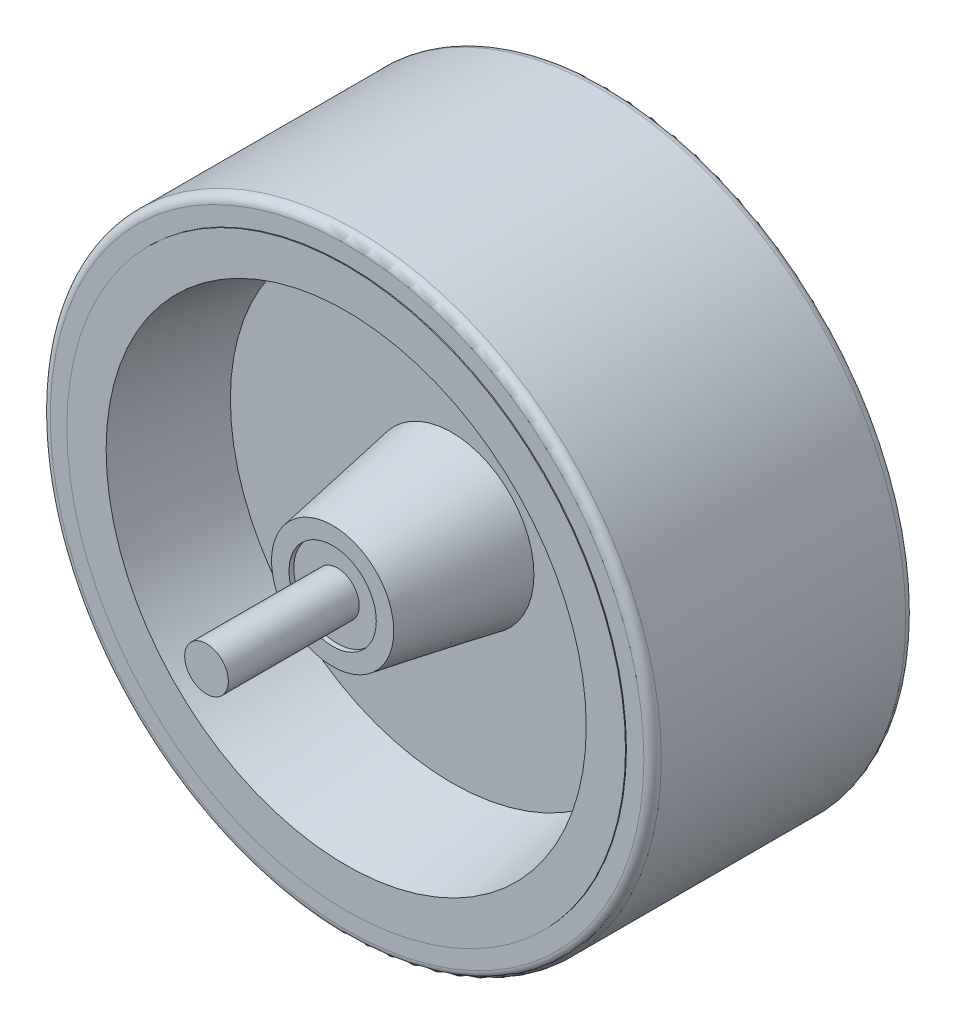
ISO-10303-21;
HEADER;
FILE_DESCRIPTION(('STEP AP214'),'2;1');
FILE_NAME('part.step','',(''),(''),'','','');
FILE_SCHEMA(('AUTOMOTIVE_DESIGN { 1 0 10303 214 1 1 1 1 }'));
ENDSEC;
DATA;
#1=APPLICATION_CONTEXT('core data for automotive mechanical design processes');
#2=APPLICATION_PROTOCOL_DEFINITION('international standard','automotive_design',2000,#1);
#3=PRODUCT_CONTEXT('',#1,'mechanical');
#4=PRODUCT('Part','Part','',(#3));
#5=PRODUCT_RELATED_PRODUCT_CATEGORY('part','',(#4));
#6=PRODUCT_DEFINITION_FORMATION('','',#4);
#7=PRODUCT_DEFINITION_CONTEXT('part definition',#1,'design');
#8=PRODUCT_DEFINITION('design','',#6,#7);
#9=PRODUCT_DEFINITION_SHAPE('','',#8);
#10=(LENGTH_UNIT() NAMED_UNIT(*) SI_UNIT(.MILLI.,.METRE.));
#11=(NAMED_UNIT(*) PLANE_ANGLE_UNIT() SI_UNIT($,.RADIAN.));
#12=(NAMED_UNIT(*) SI_UNIT($,.STERADIAN.) SOLID_ANGLE_UNIT());
#13=UNCERTAINTY_MEASURE_WITH_UNIT(LENGTH_MEASURE(1.E-05),#10,'distance_accuracy_value','');
#14=(GEOMETRIC_REPRESENTATION_CONTEXT(3) GLOBAL_UNCERTAINTY_ASSIGNED_CONTEXT((#13)) GLOBAL_UNIT_ASSIGNED_CONTEXT((#10,
#11,#12)) REPRESENTATION_CONTEXT('',''));
#15=CARTESIAN_POINT('',(0.,0.,0.));
#16=DIRECTION('',(0.,0.,1.));
#17=DIRECTION('',(1.,0.,0.));
#18=AXIS2_PLACEMENT_3D('',#15,#16,#17);
#19=CARTESIAN_POINT('',(0.,0.,-40.894));
#20=DIRECTION('',(0.,0.,1.));
#21=DIRECTION('',(1.,0.,0.));
#22=AXIS2_PLACEMENT_3D('',#19,#20,#21);
#23=PLANE('',#22);
#24=CARTESIAN_POINT('',(0.,0.,-40.894));
#25=DIRECTION('',(0.,0.,1.));
#26=DIRECTION('',(1.,0.,0.));
#27=AXIS2_PLACEMENT_3D('',#24,#25,#26);
#28=CIRCLE('',#27,6.35);
#29=CARTESIAN_POINT('',(6.35,0.,-40.894));
#30=VERTEX_POINT('',#29);
#31=EDGE_CURVE('E11',#30,#30,#28,.F.);
#32=ORIENTED_EDGE('',*,*,#31,.F.);
#33=EDGE_LOOP('',(#32));
#34=FACE_BOUND('',#33,.T.);
#35=CARTESIAN_POINT('',(0.,0.,-40.894));
#36=DIRECTION('',(0.,0.,1.));
#37=DIRECTION('',(1.,0.,0.));
#38=AXIS2_PLACEMENT_3D('',#35,#36,#37);
#39=CIRCLE('',#38,12.7);
#40=CARTESIAN_POINT('',(12.7,0.,-40.894));
#41=VERTEX_POINT('',#40);
#42=EDGE_CURVE('E96',#41,#41,#39,.T.);
#43=ORIENTED_EDGE('',*,*,#42,.F.);
#44=EDGE_LOOP('',(#43));
#45=FACE_BOUND('',#44,.T.);
#46=ADVANCED_FACE('F44',(#34,#45),#23,.F.);
#47=CARTESIAN_POINT('',(0.,0.,40.894));
#48=DIRECTION('',(0.,0.,-1.));
#49=DIRECTION('',(-1.,0.,0.));
#50=AXIS2_PLACEMENT_3D('',#47,#48,#49);
#51=PLANE('',#50);
#52=CARTESIAN_POINT('',(0.,0.,40.894));
#53=DIRECTION('',(0.,0.,-1.));
#54=DIRECTION('',(-1.,0.,0.));
#55=AXIS2_PLACEMENT_3D('',#52,#53,#54);
#56=CIRCLE('',#55,6.35);
#57=CARTESIAN_POINT('',(-6.35,0.,40.894));
#58=VERTEX_POINT('',#57);
#59=EDGE_CURVE('E50',#58,#58,#56,.F.);
#60=ORIENTED_EDGE('',*,*,#59,.F.);
#61=EDGE_LOOP('',(#60));
#62=FACE_BOUND('',#61,.T.);
#63=CARTESIAN_POINT('',(0.,0.,40.894));
#64=DIRECTION('',(0.,0.,1.));
#65=DIRECTION('',(1.,0.,0.));
#66=AXIS2_PLACEMENT_3D('',#63,#64,#65);
#67=CIRCLE('',#66,12.7);
#68=CARTESIAN_POINT('',(12.7,0.,40.894));
#69=VERTEX_POINT('',#68);
#70=EDGE_CURVE('E54',#69,#69,#67,.T.);
#71=ORIENTED_EDGE('',*,*,#70,.T.);
#72=EDGE_LOOP('',(#71));
#73=FACE_BOUND('',#72,.T.);
#74=ADVANCED_FACE('F121',(#62,#73),#51,.F.);
#75=CARTESIAN_POINT('',(0.,0.,0.));
#76=DIRECTION('',(0.,0.,1.));
#77=DIRECTION('',(1.,0.,0.));
#78=AXIS2_PLACEMENT_3D('',#75,#76,#77);
#79=CYLINDRICAL_SURFACE('',#78,12.7);
#80=ORIENTED_EDGE('',*,*,#70,.F.);
#81=EDGE_LOOP('',(#80));
#82=FACE_BOUND('',#81,.T.);
#83=CARTESIAN_POINT('',(0.,0.,42.291));
#84=DIRECTION('',(0.,0.,1.));
#85=DIRECTION('',(1.,0.,0.));
#86=AXIS2_PLACEMENT_3D('',#83,#84,#85);
#87=CIRCLE('',#86,12.7);
#88=CARTESIAN_POINT('',(12.7,0.,42.291));
#89=VERTEX_POINT('',#88);
#90=EDGE_CURVE('E58',#89,#89,#87,.T.);
#91=ORIENTED_EDGE('',*,*,#90,.T.);
#92=EDGE_LOOP('',(#91));
#93=FACE_BOUND('',#92,.T.);
#94=ADVANCED_FACE('F126',(#82,#93),#79,.F.);
#95=CARTESIAN_POINT('',(-12.7,0.,42.291));
#96=DIRECTION('',(0.,0.,-1.));
#97=DIRECTION('',(-1.,0.,0.));
#98=AXIS2_PLACEMENT_3D('',#95,#96,#97);
#99=PLANE('',#98);
#100=ORIENTED_EDGE('',*,*,#90,.F.);
#101=EDGE_LOOP('',(#100));
#102=FACE_BOUND('',#101,.T.);
#103=CARTESIAN_POINT('',(0.,0.,42.291));
#104=DIRECTION('',(0.,0.,1.));
#105=DIRECTION('',(1.,0.,0.));
#106=AXIS2_PLACEMENT_3D('',#103,#104,#105);
#107=CIRCLE('',#106,17.78);
#108=CARTESIAN_POINT('',(17.78,0.,42.291));
#109=VERTEX_POINT('',#108);
#110=EDGE_CURVE('E63',#109,#109,#107,.T.);
#111=ORIENTED_EDGE('',*,*,#110,.T.);
#112=EDGE_LOOP('',(#111));
#113=FACE_BOUND('',#112,.T.);
#114=ADVANCED_FACE('F181',(#102,#113),#99,.F.);
#115=CARTESIAN_POINT('',(0.,0.,7.62));
#116=DIRECTION('',(0.,0.,-1.));
#117=DIRECTION('',(-1.,0.,0.));
#118=AXIS2_PLACEMENT_3D('',#115,#116,#117);
#119=CONICAL_SURFACE('',#118,23.8934327481431,0.17453292519943);
#120=ORIENTED_EDGE('',*,*,#110,.F.);
#121=EDGE_LOOP('',(#120));
#122=FACE_BOUND('',#121,.T.);
#123=CARTESIAN_POINT('',(0.,0.,7.62));
#124=DIRECTION('',(0.,0.,1.));
#125=DIRECTION('',(1.,0.,0.));
#126=AXIS2_PLACEMENT_3D('',#123,#124,#125);
#127=CIRCLE('',#126,23.8934327481431);
#128=CARTESIAN_POINT('',(23.8934327481431,0.,7.62));
#129=VERTEX_POINT('',#128);
#130=EDGE_CURVE('E66',#129,#129,#127,.T.);
#131=ORIENTED_EDGE('',*,*,#130,.T.);
#132=EDGE_LOOP('',(#131));
#133=FACE_BOUND('',#132,.T.);
#134=ADVANCED_FACE('F177',(#122,#133),#119,.T.);
#135=CARTESIAN_POINT('',(-23.8934327481431,0.,7.62));
#136=DIRECTION('',(0.,0.,-1.));
#137=DIRECTION('',(-1.,0.,0.));
#138=AXIS2_PLACEMENT_3D('',#135,#136,#137);
#139=PLANE('',#138);
#140=ORIENTED_EDGE('',*,*,#130,.F.);
#141=EDGE_LOOP('',(#140));
#142=FACE_BOUND('',#141,.T.);
#143=CARTESIAN_POINT('',(0.,0.,7.62000000000001));
#144=DIRECTION('',(0.,0.,1.));
#145=DIRECTION('',(1.,0.,0.));
#146=AXIS2_PLACEMENT_3D('',#143,#144,#145);
#147=CIRCLE('',#146,64.4307665749062);
#148=CARTESIAN_POINT('',(64.4307665749062,0.,7.62000000000001));
#149=VERTEX_POINT('',#148);
#150=EDGE_CURVE('E69',#149,#149,#147,.T.);
#151=ORIENTED_EDGE('',*,*,#150,.T.);
#152=EDGE_LOOP('',(#151));
#153=FACE_BOUND('',#152,.T.);
#154=ADVANCED_FACE('F173',(#142,#153),#139,.F.);
#155=CARTESIAN_POINT('',(0.,0.,38.354));
#156=DIRECTION('',(0.,0.,1.));
#157=DIRECTION('',(1.,0.,0.));
#158=AXIS2_PLACEMENT_3D('',#155,#156,#157);
#159=CONICAL_SURFACE('',#158,69.85,0.174532925199429);
#160=ORIENTED_EDGE('',*,*,#150,.F.);
#161=EDGE_LOOP('',(#160));
#162=FACE_BOUND('',#161,.T.);
#163=CARTESIAN_POINT('',(0.,0.,38.354));
#164=DIRECTION('',(0.,0.,1.));
#165=DIRECTION('',(1.,0.,0.));
#166=AXIS2_PLACEMENT_3D('',#163,#164,#165);
#167=CIRCLE('',#166,69.85);
#168=CARTESIAN_POINT('',(69.85,0.,38.354));
#169=VERTEX_POINT('',#168);
#170=EDGE_CURVE('E72',#169,#169,#167,.T.);
#171=ORIENTED_EDGE('',*,*,#170,.T.);
#172=EDGE_LOOP('',(#171));
#173=FACE_BOUND('',#172,.T.);
#174=ADVANCED_FACE('F169',(#162,#173),#159,.F.);
#175=CARTESIAN_POINT('',(-69.85,0.,38.354));
#176=DIRECTION('',(0.,0.,-1.));
#177=DIRECTION('',(-1.,0.,0.));
#178=AXIS2_PLACEMENT_3D('',#175,#176,#177);
#179=PLANE('',#178);
#180=ORIENTED_EDGE('',*,*,#170,.F.);
#181=EDGE_LOOP('',(#180));
#182=FACE_BOUND('',#181,.T.);
#183=CARTESIAN_POINT('',(0.,0.,38.354));
#184=DIRECTION('',(0.,0.,1.));
#185=DIRECTION('',(1.,0.,0.));
#186=AXIS2_PLACEMENT_3D('',#183,#184,#185);
#187=CIRCLE('',#186,81.28);
#188=CARTESIAN_POINT('',(81.28,0.,38.354));
#189=VERTEX_POINT('',#188);
#190=EDGE_CURVE('E75',#189,#189,#187,.T.);
#191=ORIENTED_EDGE('',*,*,#190,.T.);
#192=EDGE_LOOP('',(#191));
#193=FACE_BOUND('',#192,.T.);
#194=ADVANCED_FACE('F165',(#182,#193),#179,.F.);
#195=CARTESIAN_POINT('',(0.,0.,0.));
#196=DIRECTION('',(0.,0.,1.));
#197=DIRECTION('',(1.,0.,0.));
#198=AXIS2_PLACEMENT_3D('',#195,#196,#197);
#199=CYLINDRICAL_SURFACE('',#198,81.28);
#200=ORIENTED_EDGE('',*,*,#190,.F.);
#201=EDGE_LOOP('',(#200));
#202=FACE_BOUND('',#201,.T.);
#203=CARTESIAN_POINT('',(0.,0.,-38.354));
#204=DIRECTION('',(0.,0.,1.));
#205=DIRECTION('',(1.,0.,0.));
#206=AXIS2_PLACEMENT_3D('',#203,#204,#205);
#207=CIRCLE('',#206,81.28);
#208=CARTESIAN_POINT('',(81.28,0.,-38.354));
#209=VERTEX_POINT('',#208);
#210=EDGE_CURVE('E78',#209,#209,#207,.T.);
#211=ORIENTED_EDGE('',*,*,#210,.T.);
#212=EDGE_LOOP('',(#211));
#213=FACE_BOUND('',#212,.T.);
#214=ADVANCED_FACE('F161',(#202,#213),#199,.T.);
#215=CARTESIAN_POINT('',(-69.85,0.,-38.354));
#216=DIRECTION('',(0.,0.,1.));
#217=DIRECTION('',(1.,0.,0.));
#218=AXIS2_PLACEMENT_3D('',#215,#216,#217);
#219=PLANE('',#218);
#220=ORIENTED_EDGE('',*,*,#210,.F.);
#221=EDGE_LOOP('',(#220));
#222=FACE_BOUND('',#221,.T.);
#223=CARTESIAN_POINT('',(0.,0.,-38.354));
#224=DIRECTION('',(0.,0.,1.));
#225=DIRECTION('',(1.,0.,0.));
#226=AXIS2_PLACEMENT_3D('',#223,#224,#225);
#227=CIRCLE('',#226,69.85);
#228=CARTESIAN_POINT('',(69.85,0.,-38.354));
#229=VERTEX_POINT('',#228);
#230=EDGE_CURVE('E81',#229,#229,#227,.T.);
#231=ORIENTED_EDGE('',*,*,#230,.T.);
#232=EDGE_LOOP('',(#231));
#233=FACE_BOUND('',#232,.T.);
#234=ADVANCED_FACE('F157',(#222,#233),#219,.F.);
#235=CARTESIAN_POINT('',(0.,0.,-7.62000000000001));
#236=DIRECTION('',(0.,0.,-1.));
#237=DIRECTION('',(-1.,0.,0.));
#238=AXIS2_PLACEMENT_3D('',#235,#236,#237);
#239=CONICAL_SURFACE('',#238,64.4307665749062,0.174532925199429);
#240=ORIENTED_EDGE('',*,*,#230,.F.);
#241=EDGE_LOOP('',(#240));
#242=FACE_BOUND('',#241,.T.);
#243=CARTESIAN_POINT('',(0.,0.,-7.62000000000001));
#244=DIRECTION('',(0.,0.,1.));
#245=DIRECTION('',(1.,0.,0.));
#246=AXIS2_PLACEMENT_3D('',#243,#244,#245);
#247=CIRCLE('',#246,64.4307665749062);
#248=CARTESIAN_POINT('',(64.4307665749062,0.,-7.62000000000001));
#249=VERTEX_POINT('',#248);
#250=EDGE_CURVE('E84',#249,#249,#247,.T.);
#251=ORIENTED_EDGE('',*,*,#250,.T.);
#252=EDGE_LOOP('',(#251));
#253=FACE_BOUND('',#252,.T.);
#254=ADVANCED_FACE('F153',(#242,#253),#239,.F.);
#255=CARTESIAN_POINT('',(-23.8934327481431,0.,-7.62));
#256=DIRECTION('',(0.,0.,1.));
#257=DIRECTION('',(1.,0.,0.));
#258=AXIS2_PLACEMENT_3D('',#255,#256,#257);
#259=PLANE('',#258);
#260=ORIENTED_EDGE('',*,*,#250,.F.);
#261=EDGE_LOOP('',(#260));
#262=FACE_BOUND('',#261,.T.);
#263=CARTESIAN_POINT('',(0.,0.,-7.62));
#264=DIRECTION('',(0.,0.,1.));
#265=DIRECTION('',(1.,0.,0.));
#266=AXIS2_PLACEMENT_3D('',#263,#264,#265);
#267=CIRCLE('',#266,23.8934327481431);
#268=CARTESIAN_POINT('',(23.8934327481431,0.,-7.62));
#269=VERTEX_POINT('',#268);
#270=EDGE_CURVE('E87',#269,#269,#267,.T.);
#271=ORIENTED_EDGE('',*,*,#270,.T.);
#272=EDGE_LOOP('',(#271));
#273=FACE_BOUND('',#272,.T.);
#274=ADVANCED_FACE('F149',(#262,#273),#259,.F.);
#275=CARTESIAN_POINT('',(0.,0.,-42.291));
#276=DIRECTION('',(0.,0.,1.));
#277=DIRECTION('',(1.,0.,0.));
#278=AXIS2_PLACEMENT_3D('',#275,#276,#277);
#279=CONICAL_SURFACE('',#278,17.78,0.17453292519943);
#280=ORIENTED_EDGE('',*,*,#270,.F.);
#281=EDGE_LOOP('',(#280));
#282=FACE_BOUND('',#281,.T.);
#283=CARTESIAN_POINT('',(0.,0.,-42.291));
#284=DIRECTION('',(0.,0.,1.));
#285=DIRECTION('',(1.,0.,0.));
#286=AXIS2_PLACEMENT_3D('',#283,#284,#285);
#287=CIRCLE('',#286,17.78);
#288=CARTESIAN_POINT('',(17.78,0.,-42.291));
#289=VERTEX_POINT('',#288);
#290=EDGE_CURVE('E90',#289,#289,#287,.T.);
#291=ORIENTED_EDGE('',*,*,#290,.T.);
#292=EDGE_LOOP('',(#291));
#293=FACE_BOUND('',#292,.T.);
#294=ADVANCED_FACE('F142',(#282,#293),#279,.T.);
#295=CARTESIAN_POINT('',(-12.7,0.,-42.291));
#296=DIRECTION('',(0.,0.,1.));
#297=DIRECTION('',(1.,0.,0.));
#298=AXIS2_PLACEMENT_3D('',#295,#296,#297);
#299=PLANE('',#298);
#300=ORIENTED_EDGE('',*,*,#290,.F.);
#301=EDGE_LOOP('',(#300));
#302=FACE_BOUND('',#301,.T.);
#303=CARTESIAN_POINT('',(0.,0.,-42.291));
#304=DIRECTION('',(0.,0.,1.));
#305=DIRECTION('',(1.,0.,0.));
#306=AXIS2_PLACEMENT_3D('',#303,#304,#305);
#307=CIRCLE('',#306,12.7);
#308=CARTESIAN_POINT('',(12.7,0.,-42.291));
#309=VERTEX_POINT('',#308);
#310=EDGE_CURVE('E93',#309,#309,#307,.T.);
#311=ORIENTED_EDGE('',*,*,#310,.T.);
#312=EDGE_LOOP('',(#311));
#313=FACE_BOUND('',#312,.T.);
#314=ADVANCED_FACE('F133',(#302,#313),#299,.F.);
#315=CARTESIAN_POINT('',(0.,0.,0.));
#316=DIRECTION('',(0.,0.,1.));
#317=DIRECTION('',(1.,0.,0.));
#318=AXIS2_PLACEMENT_3D('',#315,#316,#317);
#319=CYLINDRICAL_SURFACE('',#318,12.7);
#320=ORIENTED_EDGE('',*,*,#310,.F.);
#321=EDGE_LOOP('',(#320));
#322=FACE_BOUND('',#321,.T.);
#323=ORIENTED_EDGE('',*,*,#42,.T.);
#324=EDGE_LOOP('',(#323));
#325=FACE_BOUND('',#324,.T.);
#326=ADVANCED_FACE('F131',(#322,#325),#319,.F.);
#327=CARTESIAN_POINT('',(0.,0.,78.994));
#328=DIRECTION('',(0.,0.,-1.));
#329=DIRECTION('',(-1.,0.,0.));
#330=AXIS2_PLACEMENT_3D('',#327,#328,#329);
#331=CYLINDRICAL_SURFACE('',#330,6.35);
#332=CARTESIAN_POINT('',(0.,0.,78.994));
#333=DIRECTION('',(0.,0.,1.));
#334=DIRECTION('',(1.,0.,0.));
#335=AXIS2_PLACEMENT_3D('',#332,#333,#334);
#336=CIRCLE('',#335,6.35);
#337=CARTESIAN_POINT('',(-6.35,0.,78.994));
#338=VERTEX_POINT('',#337);
#339=EDGE_CURVE('E99',#338,#338,#336,.T.);
#340=CARTESIAN_POINT('',(-6.35,0.,78.994));
#341=CARTESIAN_POINT('',(-6.35,0.,78.597125));
#342=CARTESIAN_POINT('',(-6.35,0.,78.20025));
#343=CARTESIAN_POINT('',(-6.35,0.,77.4065));
#344=CARTESIAN_POINT('',(-6.35,0.,77.009625));
#345=CARTESIAN_POINT('',(-6.35,0.,76.215875));
#346=CARTESIAN_POINT('',(-6.35,0.,75.819));
#347=CARTESIAN_POINT('',(-6.35,0.,75.02525));
#348=CARTESIAN_POINT('',(-6.35,0.,74.628375));
#349=CARTESIAN_POINT('',(-6.35,0.,73.834625));
#350=CARTESIAN_POINT('',(-6.35,0.,73.43775));
#351=CARTESIAN_POINT('',(-6.35,0.,72.644));
#352=CARTESIAN_POINT('',(-6.35,0.,72.247125));
#353=CARTESIAN_POINT('',(-6.35,0.,71.453375));
#354=CARTESIAN_POINT('',(-6.35,0.,71.0565));
#355=CARTESIAN_POINT('',(-6.35,0.,70.26275));
#356=CARTESIAN_POINT('',(-6.35,0.,69.865875));
#357=CARTESIAN_POINT('',(-6.35,0.,69.072125));
#358=CARTESIAN_POINT('',(-6.35,0.,68.67525));
#359=CARTESIAN_POINT('',(-6.35,0.,67.8815));
#360=CARTESIAN_POINT('',(-6.35,0.,67.484625));
#361=CARTESIAN_POINT('',(-6.35,0.,66.690875));
#362=CARTESIAN_POINT('',(-6.35,0.,66.294));
#363=CARTESIAN_POINT('',(-6.35,0.,65.50025));
#364=CARTESIAN_POINT('',(-6.35,0.,65.103375));
#365=CARTESIAN_POINT('',(-6.35,0.,64.309625));
#366=CARTESIAN_POINT('',(-6.35,0.,63.91275));
#367=CARTESIAN_POINT('',(-6.35,0.,63.119));
#368=CARTESIAN_POINT('',(-6.35,0.,62.722125));
#369=CARTESIAN_POINT('',(-6.35,0.,61.928375));
#370=CARTESIAN_POINT('',(-6.35,0.,61.5315));
#371=CARTESIAN_POINT('',(-6.35,0.,60.73775));
#372=CARTESIAN_POINT('',(-6.35,0.,60.340875));
#373=CARTESIAN_POINT('',(-6.35,0.,59.547125));
#374=CARTESIAN_POINT('',(-6.35,0.,59.15025));
#375=CARTESIAN_POINT('',(-6.35,0.,58.3565));
#376=CARTESIAN_POINT('',(-6.35,0.,57.959625));
#377=CARTESIAN_POINT('',(-6.35,0.,57.165875));
#378=CARTESIAN_POINT('',(-6.35,0.,56.769));
#379=CARTESIAN_POINT('',(-6.35,0.,55.97525));
#380=CARTESIAN_POINT('',(-6.35,0.,55.578375));
#381=CARTESIAN_POINT('',(-6.35,0.,54.784625));
#382=CARTESIAN_POINT('',(-6.35,0.,54.38775));
#383=CARTESIAN_POINT('',(-6.35,0.,53.594));
#384=CARTESIAN_POINT('',(-6.35,0.,53.197125));
#385=CARTESIAN_POINT('',(-6.35,0.,52.403375));
#386=CARTESIAN_POINT('',(-6.35,0.,52.0065));
#387=CARTESIAN_POINT('',(-6.35,0.,51.21275));
#388=CARTESIAN_POINT('',(-6.35,0.,50.815875));
#389=CARTESIAN_POINT('',(-6.35,0.,50.022125));
#390=CARTESIAN_POINT('',(-6.35,0.,49.62525));
#391=CARTESIAN_POINT('',(-6.35,0.,48.8315));
#392=CARTESIAN_POINT('',(-6.35,0.,48.434625));
#393=CARTESIAN_POINT('',(-6.35,0.,47.640875));
#394=CARTESIAN_POINT('',(-6.35,0.,47.244));
#395=CARTESIAN_POINT('',(-6.35,0.,46.45025));
#396=CARTESIAN_POINT('',(-6.35,0.,46.053375));
#397=CARTESIAN_POINT('',(-6.35,0.,45.259625));
#398=CARTESIAN_POINT('',(-6.35,0.,44.86275));
#399=CARTESIAN_POINT('',(-6.35,0.,44.069));
#400=CARTESIAN_POINT('',(-6.35,0.,43.672125));
#401=CARTESIAN_POINT('',(-6.35,0.,42.878375));
#402=CARTESIAN_POINT('',(-6.35,0.,42.4815));
#403=CARTESIAN_POINT('',(-6.35,0.,41.68775));
#404=CARTESIAN_POINT('',(-6.35,0.,41.290875));
#405=CARTESIAN_POINT('',(-6.35,0.,40.894));
#406=B_SPLINE_CURVE_WITH_KNOTS('',3,(#340,#341,#342,#343,#344,#345,#346,#347,#348,#349,#350,
#351,#352,#353,#354,#355,#356,#357,#358,#359,#360,#361,#362,#363,#364,#365,#366,#367,#368,#369,
#370,#371,#372,#373,#374,#375,#376,#377,#378,#379,#380,#381,#382,#383,#384,#385,#386,#387,#388,
#389,#390,#391,#392,#393,#394,#395,#396,#397,#398,#399,#400,#401,#402,#403,#404,#405),
.UNSPECIFIED.,.F.,.F.,(4,2,2,2,2,2,2,2,2,2,2,2,2,2,2,2,2,2,2,2,2,2,2,2,2,2,2,2,2,2,2,2,4),(0.,
1.19062499999999,2.38124999999999,3.57187499999999,4.76249999999999,5.95312499999999,
7.14374999999999,8.33437499999999,9.52499999999999,10.715625,11.90625,13.096875,14.2875,
15.478125,16.66875,17.859375,19.05,20.240625,21.43125,22.621875,23.8125,25.003125,26.19375,
27.384375,28.575,29.765625,30.95625,32.146875,33.3375,34.528125,35.71875,36.909375,38.1),.UNSPECIFIED.);
#407=EDGE_CURVE('BSEAM117',#338,#58,#406,.T.);
#408=ORIENTED_EDGE('',*,*,#339,.F.);
#409=ORIENTED_EDGE('',*,*,#59,.T.);
#410=ORIENTED_EDGE('',*,*,#407,.T.);
#411=ORIENTED_EDGE('',*,*,#407,.F.);
#412=EDGE_LOOP('',(#408,#410,#409,#411));
#413=FACE_BOUND('',#412,.T.);
#414=ADVANCED_FACE('F117',(#413),#331,.T.);
#415=CARTESIAN_POINT('',(0.,0.,78.994));
#416=DIRECTION('',(0.,0.,1.));
#417=DIRECTION('',(1.,0.,0.));
#418=AXIS2_PLACEMENT_3D('',#415,#416,#417);
#419=PLANE('',#418);
#420=ORIENTED_EDGE('',*,*,#339,.T.);
#421=EDGE_LOOP('',(#420));
#422=FACE_BOUND('',#421,.T.);
#423=ADVANCED_FACE('F110',(#422),#419,.T.);
#424=CARTESIAN_POINT('',(0.,0.,-78.994));
#425=DIRECTION('',(0.,0.,1.));
#426=DIRECTION('',(1.,0.,0.));
#427=AXIS2_PLACEMENT_3D('',#424,#425,#426);
#428=CYLINDRICAL_SURFACE('',#427,6.35);
#429=CARTESIAN_POINT('',(0.,0.,-78.994));
#430=DIRECTION('',(0.,0.,-1.));
#431=DIRECTION('',(-1.,0.,0.));
#432=AXIS2_PLACEMENT_3D('',#429,#430,#431);
#433=CIRCLE('',#432,6.35);
#434=CARTESIAN_POINT('',(6.35,0.,-78.994));
#435=VERTEX_POINT('',#434);
#436=EDGE_CURVE('E102',#435,#435,#433,.T.);
#437=CARTESIAN_POINT('',(6.35,0.,-78.994));
#438=CARTESIAN_POINT('',(6.35,0.,-78.597125));
#439=CARTESIAN_POINT('',(6.35,0.,-78.20025));
#440=CARTESIAN_POINT('',(6.35,0.,-77.4065));
#441=CARTESIAN_POINT('',(6.35,0.,-77.009625));
#442=CARTESIAN_POINT('',(6.35,0.,-76.215875));
#443=CARTESIAN_POINT('',(6.35,0.,-75.819));
#444=CARTESIAN_POINT('',(6.35,0.,-75.02525));
#445=CARTESIAN_POINT('',(6.35,0.,-74.628375));
#446=CARTESIAN_POINT('',(6.35,0.,-73.834625));
#447=CARTESIAN_POINT('',(6.35,0.,-73.43775));
#448=CARTESIAN_POINT('',(6.35,0.,-72.644));
#449=CARTESIAN_POINT('',(6.35,0.,-72.247125));
#450=CARTESIAN_POINT('',(6.35,0.,-71.453375));
#451=CARTESIAN_POINT('',(6.35,0.,-71.0565));
#452=CARTESIAN_POINT('',(6.35,0.,-70.26275));
#453=CARTESIAN_POINT('',(6.35,0.,-69.865875));
#454=CARTESIAN_POINT('',(6.35,0.,-69.072125));
#455=CARTESIAN_POINT('',(6.35,0.,-68.67525));
#456=CARTESIAN_POINT('',(6.35,0.,-67.8815));
#457=CARTESIAN_POINT('',(6.35,0.,-67.484625));
#458=CARTESIAN_POINT('',(6.35,0.,-66.690875));
#459=CARTESIAN_POINT('',(6.35,0.,-66.294));
#460=CARTESIAN_POINT('',(6.35,0.,-65.50025));
#461=CARTESIAN_POINT('',(6.35,0.,-65.103375));
#462=CARTESIAN_POINT('',(6.35,0.,-64.309625));
#463=CARTESIAN_POINT('',(6.35,0.,-63.91275));
#464=CARTESIAN_POINT('',(6.35,0.,-63.119));
#465=CARTESIAN_POINT('',(6.35,0.,-62.722125));
#466=CARTESIAN_POINT('',(6.35,0.,-61.928375));
#467=CARTESIAN_POINT('',(6.35,0.,-61.5315));
#468=CARTESIAN_POINT('',(6.35,0.,-60.73775));
#469=CARTESIAN_POINT('',(6.35,0.,-60.340875));
#470=CARTESIAN_POINT('',(6.35,0.,-59.547125));
#471=CARTESIAN_POINT('',(6.35,0.,-59.15025));
#472=CARTESIAN_POINT('',(6.35,0.,-58.3565));
#473=CARTESIAN_POINT('',(6.35,0.,-57.959625));
#474=CARTESIAN_POINT('',(6.35,0.,-57.165875));
#475=CARTESIAN_POINT('',(6.35,0.,-56.769));
#476=CARTESIAN_POINT('',(6.35,0.,-55.97525));
#477=CARTESIAN_POINT('',(6.35,0.,-55.578375));
#478=CARTESIAN_POINT('',(6.35,0.,-54.784625));
#479=CARTESIAN_POINT('',(6.35,0.,-54.38775));
#480=CARTESIAN_POINT('',(6.35,0.,-53.594));
#481=CARTESIAN_POINT('',(6.35,0.,-53.197125));
#482=CARTESIAN_POINT('',(6.35,0.,-52.403375));
#483=CARTESIAN_POINT('',(6.35,0.,-52.0065));
#484=CARTESIAN_POINT('',(6.35,0.,-51.21275));
#485=CARTESIAN_POINT('',(6.35,0.,-50.815875));
#486=CARTESIAN_POINT('',(6.35,0.,-50.022125));
#487=CARTESIAN_POINT('',(6.35,0.,-49.62525));
#488=CARTESIAN_POINT('',(6.35,0.,-48.8315));
#489=CARTESIAN_POINT('',(6.35,0.,-48.434625));
#490=CARTESIAN_POINT('',(6.35,0.,-47.640875));
#491=CARTESIAN_POINT('',(6.35,0.,-47.244));
#492=CARTESIAN_POINT('',(6.35,0.,-46.45025));
#493=CARTESIAN_POINT('',(6.35,0.,-46.053375));
#494=CARTESIAN_POINT('',(6.35,0.,-45.259625));
#495=CARTESIAN_POINT('',(6.35,0.,-44.86275));
#496=CARTESIAN_POINT('',(6.35,0.,-44.069));
#497=CARTESIAN_POINT('',(6.35,0.,-43.672125));
#498=CARTESIAN_POINT('',(6.35,0.,-42.878375));
#499=CARTESIAN_POINT('',(6.35,0.,-42.4815));
#500=CARTESIAN_POINT('',(6.35,0.,-41.68775));
#501=CARTESIAN_POINT('',(6.35,0.,-41.290875));
#502=CARTESIAN_POINT('',(6.35,0.,-40.894));
#503=B_SPLINE_CURVE_WITH_KNOTS('',3,(#437,#438,#439,#440,#441,#442,#443,#444,#445,#446,#447,
#448,#449,#450,#451,#452,#453,#454,#455,#456,#457,#458,#459,#460,#461,#462,#463,#464,#465,#466,
#467,#468,#469,#470,#471,#472,#473,#474,#475,#476,#477,#478,#479,#480,#481,#482,#483,#484,#485,
#486,#487,#488,#489,#490,#491,#492,#493,#494,#495,#496,#497,#498,#499,#500,#501,#502),
.UNSPECIFIED.,.F.,.F.,(4,2,2,2,2,2,2,2,2,2,2,2,2,2,2,2,2,2,2,2,2,2,2,2,2,2,2,2,2,2,2,2,4),(0.,
1.19062499999999,2.38124999999999,3.57187499999999,4.76249999999999,5.95312499999999,
7.14374999999999,8.33437499999999,9.52499999999999,10.715625,11.90625,13.096875,14.2875,
15.478125,16.66875,17.859375,19.05,20.240625,21.43125,22.621875,23.8125,25.003125,26.19375,
27.384375,28.575,29.765625,30.95625,32.146875,33.3375,34.528125,35.71875,36.909375,38.1),.UNSPECIFIED.);
#504=EDGE_CURVE('BSEAM108',#435,#30,#503,.T.);
#505=ORIENTED_EDGE('',*,*,#436,.F.);
#506=ORIENTED_EDGE('',*,*,#31,.T.);
#507=ORIENTED_EDGE('',*,*,#504,.T.);
#508=ORIENTED_EDGE('',*,*,#504,.F.);
#509=EDGE_LOOP('',(#505,#507,#506,#508));
#510=FACE_BOUND('',#509,.T.);
#511=ADVANCED_FACE('F108',(#510),#428,.T.);
#512=CARTESIAN_POINT('',(0.,0.,-78.994));
#513=DIRECTION('',(0.,0.,-1.));
#514=DIRECTION('',(-1.,0.,0.));
#515=AXIS2_PLACEMENT_3D('',#512,#513,#514);
#516=PLANE('',#515);
#517=ORIENTED_EDGE('',*,*,#436,.T.);
#518=EDGE_LOOP('',(#517));
#519=FACE_BOUND('',#518,.T.);
#520=ADVANCED_FACE('F106',(#519),#516,.T.);
#521=CLOSED_SHELL('',(#46,#74,#94,#114,#134,#154,#174,#194,#214,#234,#254,#274,#294,#314,#326,
#414,#423,#511,#520));
#522=MANIFOLD_SOLID_BREP('B2',#521);
#523=CARTESIAN_POINT('',(0.,0.,38.1));
#524=DIRECTION('',(0.,0.,1.));
#525=DIRECTION('',(1.,0.,0.));
#526=AXIS2_PLACEMENT_3D('',#523,#524,#525);
#527=PLANE('',#526);
#528=CARTESIAN_POINT('',(0.,0.,38.1));
#529=DIRECTION('',(0.,0.,1.));
#530=DIRECTION('',(1.,0.,0.));
#531=AXIS2_PLACEMENT_3D('',#528,#529,#530);
#532=CIRCLE('',#531,86.36);
#533=CARTESIAN_POINT('',(86.36,0.,38.1));
#534=VERTEX_POINT('',#533);
#535=EDGE_CURVE('E43',#534,#534,#532,.T.);
#536=ORIENTED_EDGE('',*,*,#535,.T.);
#537=EDGE_LOOP('',(#536));
#538=FACE_BOUND('',#537,.T.);
#539=CARTESIAN_POINT('',(0.,0.,38.1));
#540=DIRECTION('',(0.,0.,1.));
#541=DIRECTION('',(1.,0.,0.));
#542=AXIS2_PLACEMENT_3D('',#539,#540,#541);
#543=CIRCLE('',#542,78.74);
#544=CARTESIAN_POINT('',(-78.74,0.,38.1));
#545=VERTEX_POINT('',#544);
#546=EDGE_CURVE('E344',#545,#545,#543,.T.);
#547=ORIENTED_EDGE('',*,*,#546,.F.);
#548=EDGE_LOOP('',(#547));
#549=FACE_BOUND('',#548,.T.);
#550=ADVANCED_FACE('F324',(#538,#549),#527,.T.);
#551=CARTESIAN_POINT('',(0.,0.,-38.1));
#552=DIRECTION('',(0.,0.,1.));
#553=DIRECTION('',(1.,0.,0.));
#554=AXIS2_PLACEMENT_3D('',#551,#552,#553);
#555=PLANE('',#554);
#556=CARTESIAN_POINT('',(0.,0.,-38.1));
#557=DIRECTION('',(0.,0.,1.));
#558=DIRECTION('',(1.,0.,0.));
#559=AXIS2_PLACEMENT_3D('',#556,#557,#558);
#560=CIRCLE('',#559,86.36);
#561=CARTESIAN_POINT('',(86.36,0.,-38.1));
#562=VERTEX_POINT('',#561);
#563=EDGE_CURVE('E331',#562,#562,#560,.F.);
#564=ORIENTED_EDGE('',*,*,#563,.T.);
#565=EDGE_LOOP('',(#564));
#566=FACE_BOUND('',#565,.T.);
#567=CARTESIAN_POINT('',(0.,0.,-38.1));
#568=DIRECTION('',(0.,0.,1.));
#569=DIRECTION('',(1.,0.,0.));
#570=AXIS2_PLACEMENT_3D('',#567,#568,#569);
#571=CIRCLE('',#570,78.74);
#572=CARTESIAN_POINT('',(-78.74,0.,-38.1));
#573=VERTEX_POINT('',#572);
#574=EDGE_CURVE('E345',#573,#573,#571,.T.);
#575=ORIENTED_EDGE('',*,*,#574,.T.);
#576=EDGE_LOOP('',(#575));
#577=FACE_BOUND('',#576,.T.);
#578=ADVANCED_FACE('F355',(#566,#577),#555,.F.);
#579=CARTESIAN_POINT('',(0.,0.,38.1));
#580=DIRECTION('',(0.,0.,-1.));
#581=DIRECTION('',(-1.,0.,0.));
#582=AXIS2_PLACEMENT_3D('',#579,#580,#581);
#583=CYLINDRICAL_SURFACE('',#582,88.9);
#584=CARTESIAN_POINT('',(0.,0.,-35.56));
#585=DIRECTION('',(0.,0.,1.));
#586=DIRECTION('',(1.,0.,0.));
#587=AXIS2_PLACEMENT_3D('',#584,#585,#586);
#588=CIRCLE('',#587,88.9);
#589=CARTESIAN_POINT('',(-88.9,0.,-35.56));
#590=VERTEX_POINT('',#589);
#591=EDGE_CURVE('E335',#590,#590,#588,.T.);
#592=CARTESIAN_POINT('',(0.,0.,35.56));
#593=DIRECTION('',(0.,0.,1.));
#594=DIRECTION('',(1.,0.,0.));
#595=AXIS2_PLACEMENT_3D('',#592,#593,#594);
#596=CIRCLE('',#595,88.9);
#597=CARTESIAN_POINT('',(-88.9,0.,35.56));
#598=VERTEX_POINT('',#597);
#599=EDGE_CURVE('E339',#598,#598,#596,.F.);
#600=CARTESIAN_POINT('',(-88.9,0.,-35.56));
#601=CARTESIAN_POINT('',(-88.9,0.,-34.8191666666667));
#602=CARTESIAN_POINT('',(-88.9,0.,-34.0783333333333));
#603=CARTESIAN_POINT('',(-88.9,0.,-32.5966666666667));
#604=CARTESIAN_POINT('',(-88.9,0.,-31.8558333333333));
#605=CARTESIAN_POINT('',(-88.9,0.,-30.3741666666667));
#606=CARTESIAN_POINT('',(-88.9,0.,-29.6333333333333));
#607=CARTESIAN_POINT('',(-88.9,0.,-28.1516666666667));
#608=CARTESIAN_POINT('',(-88.9,0.,-27.4108333333333));
#609=CARTESIAN_POINT('',(-88.9,0.,-25.9291666666667));
#610=CARTESIAN_POINT('',(-88.9,0.,-25.1883333333333));
#611=CARTESIAN_POINT('',(-88.9,0.,-23.7066666666667));
#612=CARTESIAN_POINT('',(-88.9,0.,-22.9658333333334));
#613=CARTESIAN_POINT('',(-88.9,0.,-21.4841666666667));
#614=CARTESIAN_POINT('',(-88.9,0.,-20.7433333333333));
#615=CARTESIAN_POINT('',(-88.9,0.,-19.2616666666667));
#616=CARTESIAN_POINT('',(-88.9,0.,-18.5208333333333));
#617=CARTESIAN_POINT('',(-88.9,0.,-17.0391666666667));
#618=CARTESIAN_POINT('',(-88.9,0.,-16.2983333333333));
#619=CARTESIAN_POINT('',(-88.9,0.,-14.8166666666667));
#620=CARTESIAN_POINT('',(-88.9,0.,-14.0758333333333));
#621=CARTESIAN_POINT('',(-88.9,0.,-12.5941666666667));
#622=CARTESIAN_POINT('',(-88.9,0.,-11.8533333333333));
#623=CARTESIAN_POINT('',(-88.9,0.,-10.3716666666667));
#624=CARTESIAN_POINT('',(-88.9,0.,-9.63083333333334));
#625=CARTESIAN_POINT('',(-88.9,0.,-8.14916666666667));
#626=CARTESIAN_POINT('',(-88.9,0.,-7.40833333333334));
#627=CARTESIAN_POINT('',(-88.9,0.,-5.92666666666667));
#628=CARTESIAN_POINT('',(-88.9,0.,-5.18583333333334));
#629=CARTESIAN_POINT('',(-88.9,0.,-3.70416666666667));
#630=CARTESIAN_POINT('',(-88.9,0.,-2.96333333333334));
#631=CARTESIAN_POINT('',(-88.9,0.,-1.48166666666667));
#632=CARTESIAN_POINT('',(-88.9,0.,-0.740833333333341));
#633=CARTESIAN_POINT('',(-88.9,0.,0.740833333333327));
#634=CARTESIAN_POINT('',(-88.9,0.,1.48166666666666));
#635=CARTESIAN_POINT('',(-88.9,0.,2.96333333333333));
#636=CARTESIAN_POINT('',(-88.9,0.,3.70416666666666));
#637=CARTESIAN_POINT('',(-88.9,0.,5.18583333333333));
#638=CARTESIAN_POINT('',(-88.9,0.,5.92666666666666));
#639=CARTESIAN_POINT('',(-88.9,0.,7.40833333333333));
#640=CARTESIAN_POINT('',(-88.9,0.,8.14916666666666));
#641=CARTESIAN_POINT('',(-88.9,0.,9.63083333333333));
#642=CARTESIAN_POINT('',(-88.9,0.,10.3716666666667));
#643=CARTESIAN_POINT('',(-88.9,0.,11.8533333333333));
#644=CARTESIAN_POINT('',(-88.9,0.,12.5941666666667));
#645=CARTESIAN_POINT('',(-88.9,0.,14.0758333333333));
#646=CARTESIAN_POINT('',(-88.9,0.,14.8166666666667));
#647=CARTESIAN_POINT('',(-88.9,0.,16.2983333333333));
#648=CARTESIAN_POINT('',(-88.9,0.,17.0391666666667));
#649=CARTESIAN_POINT('',(-88.9,0.,18.5208333333333));
#650=CARTESIAN_POINT('',(-88.9,0.,19.2616666666667));
#651=CARTESIAN_POINT('',(-88.9,0.,20.7433333333333));
#652=CARTESIAN_POINT('',(-88.9,0.,21.4841666666667));
#653=CARTESIAN_POINT('',(-88.9,0.,22.9658333333333));
#654=CARTESIAN_POINT('',(-88.9,0.,23.7066666666667));
#655=CARTESIAN_POINT('',(-88.9,0.,25.1883333333333));
#656=CARTESIAN_POINT('',(-88.9,0.,25.9291666666667));
#657=CARTESIAN_POINT('',(-88.9,0.,27.4108333333333));
#658=CARTESIAN_POINT('',(-88.9,0.,28.1516666666667));
#659=CARTESIAN_POINT('',(-88.9,0.,29.6333333333333));
#660=CARTESIAN_POINT('',(-88.9,0.,30.3741666666667));
#661=CARTESIAN_POINT('',(-88.9,0.,31.8558333333333));
#662=CARTESIAN_POINT('',(-88.9,0.,32.5966666666667));
#663=CARTESIAN_POINT('',(-88.9,0.,34.0783333333333));
#664=CARTESIAN_POINT('',(-88.9,0.,34.8191666666667));
#665=CARTESIAN_POINT('',(-88.9,0.,35.56));
#666=B_SPLINE_CURVE_WITH_KNOTS('',3,(#600,#601,#602,#603,#604,#605,#606,#607,#608,#609,#610,
#611,#612,#613,#614,#615,#616,#617,#618,#619,#620,#621,#622,#623,#624,#625,#626,#627,#628,#629,
#630,#631,#632,#633,#634,#635,#636,#637,#638,#639,#640,#641,#642,#643,#644,#645,#646,#647,#648,
#649,#650,#651,#652,#653,#654,#655,#656,#657,#658,#659,#660,#661,#662,#663,#664,#665),
.UNSPECIFIED.,.F.,.F.,(4,2,2,2,2,2,2,2,2,2,2,2,2,2,2,2,2,2,2,2,2,2,2,2,2,2,2,2,2,2,2,2,4),(0.,
2.2225,4.445,6.66750000000001,8.89000000000001,11.1125,13.335,15.5575,17.78,20.0025,22.225,
24.4475,26.67,28.8925,31.115,33.3375,35.56,37.7825,40.005,42.2275,44.45,46.6725,48.895,51.1175,
53.34,55.5625,57.785,60.0075,62.23,64.4525,66.675,68.8975,71.12),.UNSPECIFIED.);
#667=EDGE_CURVE('BSEAM360',#590,#598,#666,.T.);
#668=ORIENTED_EDGE('',*,*,#591,.T.);
#669=ORIENTED_EDGE('',*,*,#599,.T.);
#670=ORIENTED_EDGE('',*,*,#667,.T.);
#671=ORIENTED_EDGE('',*,*,#667,.F.);
#672=EDGE_LOOP('',(#668,#670,#669,#671));
#673=FACE_BOUND('',#672,.T.);
#674=ADVANCED_FACE('F360',(#673),#583,.T.);
#675=CARTESIAN_POINT('',(0.,0.,38.1));
#676=DIRECTION('',(0.,0.,-1.));
#677=DIRECTION('',(-1.,0.,0.));
#678=AXIS2_PLACEMENT_3D('',#675,#676,#677);
#679=CYLINDRICAL_SURFACE('',#678,78.74);
#680=CARTESIAN_POINT('',(-78.74,0.,38.1));
#681=CARTESIAN_POINT('',(-78.74,0.,37.30625));
#682=CARTESIAN_POINT('',(-78.74,0.,36.5125));
#683=CARTESIAN_POINT('',(-78.74,0.,34.925));
#684=CARTESIAN_POINT('',(-78.74,0.,34.13125));
#685=CARTESIAN_POINT('',(-78.74,0.,32.54375));
#686=CARTESIAN_POINT('',(-78.74,0.,31.75));
#687=CARTESIAN_POINT('',(-78.74,0.,30.1625));
#688=CARTESIAN_POINT('',(-78.74,0.,29.36875));
#689=CARTESIAN_POINT('',(-78.74,0.,27.78125));
#690=CARTESIAN_POINT('',(-78.74,0.,26.9875));
#691=CARTESIAN_POINT('',(-78.74,0.,25.4));
#692=CARTESIAN_POINT('',(-78.74,0.,24.60625));
#693=CARTESIAN_POINT('',(-78.74,0.,23.01875));
#694=CARTESIAN_POINT('',(-78.74,0.,22.225));
#695=CARTESIAN_POINT('',(-78.74,0.,20.6375));
#696=CARTESIAN_POINT('',(-78.74,0.,19.84375));
#697=CARTESIAN_POINT('',(-78.74,0.,18.25625));
#698=CARTESIAN_POINT('',(-78.74,0.,17.4625));
#699=CARTESIAN_POINT('',(-78.74,0.,15.875));
#700=CARTESIAN_POINT('',(-78.74,0.,15.08125));
#701=CARTESIAN_POINT('',(-78.74,0.,13.49375));
#702=CARTESIAN_POINT('',(-78.74,0.,12.7));
#703=CARTESIAN_POINT('',(-78.74,0.,11.1125));
#704=CARTESIAN_POINT('',(-78.74,0.,10.31875));
#705=CARTESIAN_POINT('',(-78.74,0.,8.73124999999999));
#706=CARTESIAN_POINT('',(-78.74,0.,7.93749999999999));
#707=CARTESIAN_POINT('',(-78.74,0.,6.35));
#708=CARTESIAN_POINT('',(-78.74,0.,5.55625));
#709=CARTESIAN_POINT('',(-78.74,0.,3.96875));
#710=CARTESIAN_POINT('',(-78.74,0.,3.175));
#711=CARTESIAN_POINT('',(-78.74,0.,1.5875));
#712=CARTESIAN_POINT('',(-78.74,0.,0.793750000000001));
#713=CARTESIAN_POINT('',(-78.74,0.,-0.793750000000001));
#714=CARTESIAN_POINT('',(-78.74,0.,-1.5875));
#715=CARTESIAN_POINT('',(-78.74,0.,-3.175));
#716=CARTESIAN_POINT('',(-78.74,0.,-3.96875));
#717=CARTESIAN_POINT('',(-78.74,0.,-5.55625));
#718=CARTESIAN_POINT('',(-78.74,0.,-6.35));
#719=CARTESIAN_POINT('',(-78.74,0.,-7.93750000000001));
#720=CARTESIAN_POINT('',(-78.74,0.,-8.73125));
#721=CARTESIAN_POINT('',(-78.74,0.,-10.31875));
#722=CARTESIAN_POINT('',(-78.74,0.,-11.1125));
#723=CARTESIAN_POINT('',(-78.74,0.,-12.7));
#724=CARTESIAN_POINT('',(-78.74,0.,-13.49375));
#725=CARTESIAN_POINT('',(-78.74,0.,-15.08125));
#726=CARTESIAN_POINT('',(-78.74,0.,-15.875));
#727=CARTESIAN_POINT('',(-78.74,0.,-17.4625));
#728=CARTESIAN_POINT('',(-78.74,0.,-18.25625));
#729=CARTESIAN_POINT('',(-78.74,0.,-19.84375));
#730=CARTESIAN_POINT('',(-78.74,0.,-20.6375));
#731=CARTESIAN_POINT('',(-78.74,0.,-22.225));
#732=CARTESIAN_POINT('',(-78.74,0.,-23.01875));
#733=CARTESIAN_POINT('',(-78.74,0.,-24.60625));
#734=CARTESIAN_POINT('',(-78.74,0.,-25.4));
#735=CARTESIAN_POINT('',(-78.74,0.,-26.9875));
#736=CARTESIAN_POINT('',(-78.74,0.,-27.78125));
#737=CARTESIAN_POINT('',(-78.74,0.,-29.36875));
#738=CARTESIAN_POINT('',(-78.74,0.,-30.1625));
#739=CARTESIAN_POINT('',(-78.74,0.,-31.75));
#740=CARTESIAN_POINT('',(-78.74,0.,-32.54375));
#741=CARTESIAN_POINT('',(-78.74,0.,-34.13125));
#742=CARTESIAN_POINT('',(-78.74,0.,-34.925));
#743=CARTESIAN_POINT('',(-78.74,0.,-36.5125));
#744=CARTESIAN_POINT('',(-78.74,0.,-37.30625));
#745=CARTESIAN_POINT('',(-78.74,0.,-38.1));
#746=B_SPLINE_CURVE_WITH_KNOTS('',3,(#680,#681,#682,#683,#684,#685,#686,#687,#688,#689,#690,
#691,#692,#693,#694,#695,#696,#697,#698,#699,#700,#701,#702,#703,#704,#705,#706,#707,#708,#709,
#710,#711,#712,#713,#714,#715,#716,#717,#718,#719,#720,#721,#722,#723,#724,#725,#726,#727,#728,
#729,#730,#731,#732,#733,#734,#735,#736,#737,#738,#739,#740,#741,#742,#743,#744,#745),
.UNSPECIFIED.,.F.,.F.,(4,2,2,2,2,2,2,2,2,2,2,2,2,2,2,2,2,2,2,2,2,2,2,2,2,2,2,2,2,2,2,2,4),(0.,
2.38125,4.7625,7.14375,9.52500000000001,11.90625,14.2875,16.66875,19.05,21.43125,23.8125,
26.19375,28.575,30.95625,33.3375,35.71875,38.1,40.48125,42.8625,45.24375,47.625,50.00625,
52.3875,54.76875,57.15,59.53125,61.9125,64.29375,66.675,69.05625,71.4375,73.81875,76.2),.UNSPECIFIED.);
#747=EDGE_CURVE('BSEAM351',#545,#573,#746,.T.);
#748=ORIENTED_EDGE('',*,*,#546,.T.);
#749=ORIENTED_EDGE('',*,*,#574,.F.);
#750=ORIENTED_EDGE('',*,*,#747,.T.);
#751=ORIENTED_EDGE('',*,*,#747,.F.);
#752=EDGE_LOOP('',(#748,#750,#749,#751));
#753=FACE_BOUND('',#752,.T.);
#754=ADVANCED_FACE('F351',(#753),#679,.F.);
#755=CARTESIAN_POINT('',(0.,0.,-35.56));
#756=DIRECTION('',(0.,0.,1.));
#757=DIRECTION('',(1.,0.,0.));
#758=AXIS2_PLACEMENT_3D('',#755,#756,#757);
#759=TOROIDAL_SURFACE('',#758,86.36,2.54);
#760=ORIENTED_EDGE('',*,*,#563,.F.);
#761=EDGE_LOOP('',(#760));
#762=FACE_BOUND('',#761,.T.);
#763=ORIENTED_EDGE('',*,*,#591,.F.);
#764=EDGE_LOOP('',(#763));
#765=FACE_BOUND('',#764,.T.);
#766=ADVANCED_FACE('F366',(#762,#765),#759,.T.);
#767=CARTESIAN_POINT('',(0.,0.,35.56));
#768=DIRECTION('',(0.,0.,1.));
#769=DIRECTION('',(1.,0.,0.));
#770=AXIS2_PLACEMENT_3D('',#767,#768,#769);
#771=TOROIDAL_SURFACE('',#770,86.36,2.54);
#772=ORIENTED_EDGE('',*,*,#599,.F.);
#773=EDGE_LOOP('',(#772));
#774=FACE_BOUND('',#773,.T.);
#775=ORIENTED_EDGE('',*,*,#535,.F.);
#776=EDGE_LOOP('',(#775));
#777=FACE_BOUND('',#776,.T.);
#778=ADVANCED_FACE('F326',(#774,#777),#771,.T.);
#779=CLOSED_SHELL('',(#550,#578,#674,#754,#766,#778));
#780=MANIFOLD_SOLID_BREP('B6',#779);
#781=ADVANCED_BREP_SHAPE_REPRESENTATION('',(#18,#522,#780),#14);
#782=SHAPE_DEFINITION_REPRESENTATION(#9,#781);
ENDSEC;
END-ISO-10303-21;
